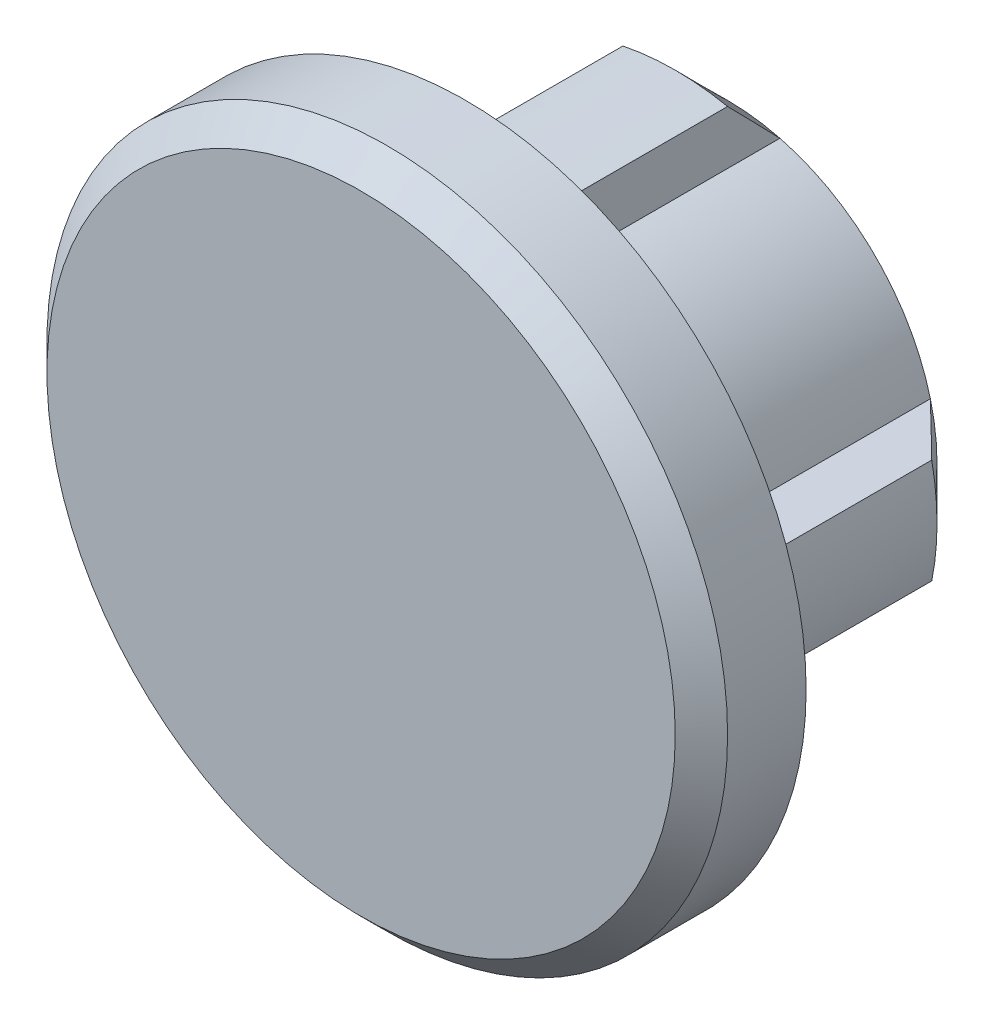
ISO-10303-21;
HEADER;
FILE_DESCRIPTION(('STEP AP214'),'2;1');
FILE_NAME('part.step','',(''),(''),'','','');
FILE_SCHEMA(('AUTOMOTIVE_DESIGN { 1 0 10303 214 1 1 1 1 }'));
ENDSEC;
DATA;
#1=APPLICATION_CONTEXT('core data for automotive mechanical design processes');
#2=APPLICATION_PROTOCOL_DEFINITION('international standard','automotive_design',2000,#1);
#3=PRODUCT_CONTEXT('',#1,'mechanical');
#4=PRODUCT('Part','Part','',(#3));
#5=PRODUCT_RELATED_PRODUCT_CATEGORY('part','',(#4));
#6=PRODUCT_DEFINITION_FORMATION('','',#4);
#7=PRODUCT_DEFINITION_CONTEXT('part definition',#1,'design');
#8=PRODUCT_DEFINITION('design','',#6,#7);
#9=PRODUCT_DEFINITION_SHAPE('','',#8);
#10=(LENGTH_UNIT() NAMED_UNIT(*) SI_UNIT(.MILLI.,.METRE.));
#11=(NAMED_UNIT(*) PLANE_ANGLE_UNIT() SI_UNIT($,.RADIAN.));
#12=(NAMED_UNIT(*) SI_UNIT($,.STERADIAN.) SOLID_ANGLE_UNIT());
#13=UNCERTAINTY_MEASURE_WITH_UNIT(LENGTH_MEASURE(1.E-05),#10,'distance_accuracy_value','');
#14=(GEOMETRIC_REPRESENTATION_CONTEXT(3) GLOBAL_UNCERTAINTY_ASSIGNED_CONTEXT((#13)) GLOBAL_UNIT_ASSIGNED_CONTEXT((#10,
#11,#12)) REPRESENTATION_CONTEXT('',''));
#15=CARTESIAN_POINT('',(0.,0.,0.));
#16=DIRECTION('',(0.,0.,1.));
#17=DIRECTION('',(1.,0.,0.));
#18=AXIS2_PLACEMENT_3D('',#15,#16,#17);
#19=CARTESIAN_POINT('',(0.,0.,-5.));
#20=DIRECTION('',(0.,0.,1.));
#21=DIRECTION('',(1.,0.,0.));
#22=AXIS2_PLACEMENT_3D('',#19,#20,#21);
#23=CYLINDRICAL_SURFACE('',#22,5.);
#24=DIRECTION('',(0.,0.,-1.));
#25=VECTOR('',#24,1.);
#26=CARTESIAN_POINT('',(-4.89897948556636,1.,5.51398966790242));
#27=LINE('',#26,#25);
#28=CARTESIAN_POINT('',(-4.89897948556636,1.,0.));
#29=VERTEX_POINT('',#28);
#30=CARTESIAN_POINT('',(-4.89897948556636,1.,-4.));
#31=VERTEX_POINT('',#30);
#32=EDGE_CURVE('E261',#29,#31,#27,.T.);
#33=ORIENTED_EDGE('',*,*,#32,.T.);
#34=CARTESIAN_POINT('',(0.,0.,-4.));
#35=DIRECTION('',(0.,0.,1.));
#36=DIRECTION('',(1.,0.,0.));
#37=AXIS2_PLACEMENT_3D('',#34,#35,#36);
#38=CIRCLE('',#37,5.);
#39=CARTESIAN_POINT('',(-4.89897948556636,-1.,-4.));
#40=VERTEX_POINT('',#39);
#41=EDGE_CURVE('E699',#31,#40,#38,.T.);
#42=ORIENTED_EDGE('',*,*,#41,.T.);
#43=DIRECTION('',(0.,0.,-1.));
#44=VECTOR('',#43,1.);
#45=CARTESIAN_POINT('',(-4.89897948556636,-1.,5.51398966790242));
#46=LINE('',#45,#44);
#47=CARTESIAN_POINT('',(-4.89897948556636,-1.,0.));
#48=VERTEX_POINT('',#47);
#49=EDGE_CURVE('E203',#48,#40,#46,.T.);
#50=ORIENTED_EDGE('',*,*,#49,.F.);
#51=CARTESIAN_POINT('',(0.,0.,0.));
#52=DIRECTION('',(0.,0.,1.));
#53=DIRECTION('',(1.,0.,0.));
#54=AXIS2_PLACEMENT_3D('',#51,#52,#53);
#55=CIRCLE('',#54,5.);
#56=CARTESIAN_POINT('',(-4.58257569495584,-2.,0.));
#57=VERTEX_POINT('',#56);
#58=EDGE_CURVE('E197',#57,#48,#55,.F.);
#59=ORIENTED_EDGE('',*,*,#58,.F.);
#60=DIRECTION('',(0.,0.,-1.));
#61=VECTOR('',#60,1.);
#62=CARTESIAN_POINT('',(-4.58257569495584,-2.,0.5));
#63=LINE('',#62,#61);
#64=CARTESIAN_POINT('',(-4.58257569495584,-2.,0.5));
#65=VERTEX_POINT('',#64);
#66=EDGE_CURVE('E294',#65,#57,#63,.T.);
#67=ORIENTED_EDGE('',*,*,#66,.F.);
#68=CARTESIAN_POINT('',(0.,0.,0.5));
#69=DIRECTION('',(0.,0.,1.));
#70=DIRECTION('',(-1.,0.,0.));
#71=AXIS2_PLACEMENT_3D('',#68,#69,#70);
#72=CIRCLE('',#71,5.);
#73=CARTESIAN_POINT('',(-4.58257569495584,2.,0.5));
#74=VERTEX_POINT('',#73);
#75=EDGE_CURVE('E282',#74,#65,#72,.T.);
#76=ORIENTED_EDGE('',*,*,#75,.F.);
#77=DIRECTION('',(0.,0.,-1.));
#78=VECTOR('',#77,1.);
#79=CARTESIAN_POINT('',(-4.58257569495584,2.,0.5));
#80=LINE('',#79,#78);
#81=CARTESIAN_POINT('',(-4.58257569495584,2.,0.));
#82=VERTEX_POINT('',#81);
#83=EDGE_CURVE('E298',#74,#82,#80,.T.);
#84=ORIENTED_EDGE('',*,*,#83,.T.);
#85=CARTESIAN_POINT('',(0.,0.,0.));
#86=DIRECTION('',(0.,0.,1.));
#87=DIRECTION('',(1.,0.,0.));
#88=AXIS2_PLACEMENT_3D('',#85,#86,#87);
#89=CIRCLE('',#88,5.);
#90=EDGE_CURVE('E271',#29,#82,#89,.F.);
#91=ORIENTED_EDGE('',*,*,#90,.F.);
#92=EDGE_LOOP('',(#33,#42,#50,#59,#67,#76,#84,#91));
#93=FACE_BOUND('',#92,.T.);
#94=ADVANCED_FACE('F33',(#93),#23,.T.);
#95=DIRECTION('',(0.,0.,-1.));
#96=VECTOR('',#95,1.);
#97=CARTESIAN_POINT('',(-1.,-4.89897948556636,5.51398966790242));
#98=LINE('',#97,#96);
#99=CARTESIAN_POINT('',(-1.,-4.89897948556636,0.));
#100=VERTEX_POINT('',#99);
#101=CARTESIAN_POINT('',(-1.,-4.89897948556636,-4.));
#102=VERTEX_POINT('',#101);
#103=EDGE_CURVE('E204',#100,#102,#98,.T.);
#104=ORIENTED_EDGE('',*,*,#103,.T.);
#105=CARTESIAN_POINT('',(0.,0.,-4.));
#106=DIRECTION('',(0.,0.,1.));
#107=DIRECTION('',(1.,0.,0.));
#108=AXIS2_PLACEMENT_3D('',#105,#106,#107);
#109=CIRCLE('',#108,5.);
#110=CARTESIAN_POINT('',(0.999999999999999,-4.89897948556636,-4.));
#111=VERTEX_POINT('',#110);
#112=EDGE_CURVE('E365',#102,#111,#109,.T.);
#113=ORIENTED_EDGE('',*,*,#112,.T.);
#114=DIRECTION('',(0.,0.,-1.));
#115=VECTOR('',#114,1.);
#116=CARTESIAN_POINT('',(0.999999999999999,-4.89897948556636,5.51398966790242));
#117=LINE('',#116,#115);
#118=CARTESIAN_POINT('',(0.999999999999999,-4.89897948556636,0.));
#119=VERTEX_POINT('',#118);
#120=EDGE_CURVE('E226',#119,#111,#117,.T.);
#121=ORIENTED_EDGE('',*,*,#120,.F.);
#122=CARTESIAN_POINT('',(0.,0.,0.));
#123=DIRECTION('',(0.,0.,1.));
#124=DIRECTION('',(1.,0.,0.));
#125=AXIS2_PLACEMENT_3D('',#122,#123,#124);
#126=CIRCLE('',#125,5.);
#127=EDGE_CURVE('E318',#100,#119,#126,.T.);
#128=ORIENTED_EDGE('',*,*,#127,.F.);
#129=EDGE_LOOP('',(#104,#113,#121,#128));
#130=FACE_BOUND('',#129,.T.);
#131=ADVANCED_FACE('F485',(#130),#23,.T.);
#132=DIRECTION('',(0.,0.,-1.));
#133=VECTOR('',#132,1.);
#134=CARTESIAN_POINT('',(1.,4.89897948556636,5.51398966790242));
#135=LINE('',#134,#133);
#136=CARTESIAN_POINT('',(1.,4.89897948556636,0.));
#137=VERTEX_POINT('',#136);
#138=CARTESIAN_POINT('',(1.,4.89897948556636,-4.));
#139=VERTEX_POINT('',#138);
#140=EDGE_CURVE('E237',#137,#139,#135,.T.);
#141=ORIENTED_EDGE('',*,*,#140,.T.);
#142=CARTESIAN_POINT('',(0.,0.,-4.));
#143=DIRECTION('',(0.,0.,1.));
#144=DIRECTION('',(1.,0.,0.));
#145=AXIS2_PLACEMENT_3D('',#142,#143,#144);
#146=CIRCLE('',#145,5.);
#147=CARTESIAN_POINT('',(-1.,4.89897948556636,-4.));
#148=VERTEX_POINT('',#147);
#149=EDGE_CURVE('E327',#139,#148,#146,.T.);
#150=ORIENTED_EDGE('',*,*,#149,.T.);
#151=DIRECTION('',(0.,0.,-1.));
#152=VECTOR('',#151,1.);
#153=CARTESIAN_POINT('',(-1.,4.89897948556636,5.51398966790242));
#154=LINE('',#153,#152);
#155=CARTESIAN_POINT('',(-1.,4.89897948556636,0.));
#156=VERTEX_POINT('',#155);
#157=EDGE_CURVE('E270',#156,#148,#154,.T.);
#158=ORIENTED_EDGE('',*,*,#157,.F.);
#159=EDGE_CURVE('E317',#137,#156,#126,.T.);
#160=ORIENTED_EDGE('',*,*,#159,.F.);
#161=EDGE_LOOP('',(#141,#150,#158,#160));
#162=FACE_BOUND('',#161,.T.);
#163=ADVANCED_FACE('F441',(#162),#23,.T.);
#164=DIRECTION('',(0.,0.,-1.));
#165=VECTOR('',#164,1.);
#166=CARTESIAN_POINT('',(4.89897948556636,-1.,5.51398966790242));
#167=LINE('',#166,#165);
#168=CARTESIAN_POINT('',(4.89897948556636,-1.,0.));
#169=VERTEX_POINT('',#168);
#170=CARTESIAN_POINT('',(4.89897948556636,-1.,-4.));
#171=VERTEX_POINT('',#170);
#172=EDGE_CURVE('E220',#169,#171,#167,.T.);
#173=ORIENTED_EDGE('',*,*,#172,.T.);
#174=CARTESIAN_POINT('',(0.,0.,-4.));
#175=DIRECTION('',(0.,0.,1.));
#176=DIRECTION('',(1.,0.,0.));
#177=AXIS2_PLACEMENT_3D('',#174,#175,#176);
#178=CIRCLE('',#177,5.);
#179=CARTESIAN_POINT('',(4.89897948556636,0.999999999999999,-4.));
#180=VERTEX_POINT('',#179);
#181=EDGE_CURVE('E394',#171,#180,#178,.T.);
#182=ORIENTED_EDGE('',*,*,#181,.T.);
#183=DIRECTION('',(0.,0.,-1.));
#184=VECTOR('',#183,1.);
#185=CARTESIAN_POINT('',(4.89897948556636,0.999999999999999,5.51398966790242));
#186=LINE('',#185,#184);
#187=CARTESIAN_POINT('',(4.89897948556636,0.999999999999999,0.));
#188=VERTEX_POINT('',#187);
#189=EDGE_CURVE('E246',#188,#180,#186,.T.);
#190=ORIENTED_EDGE('',*,*,#189,.F.);
#191=EDGE_CURVE('E321',#169,#188,#126,.T.);
#192=ORIENTED_EDGE('',*,*,#191,.F.);
#193=EDGE_LOOP('',(#173,#182,#190,#192));
#194=FACE_BOUND('',#193,.T.);
#195=ADVANCED_FACE('F431',(#194),#23,.T.);
#196=CARTESIAN_POINT('',(0.,0.,-5.));
#197=DIRECTION('',(0.,0.,1.));
#198=DIRECTION('',(1.,0.,0.));
#199=AXIS2_PLACEMENT_3D('',#196,#197,#198);
#200=PLANE('',#199);
#201=CARTESIAN_POINT('',(0.,0.,-5.));
#202=DIRECTION('',(0.,0.,1.));
#203=DIRECTION('',(-1.,0.,0.));
#204=AXIS2_PLACEMENT_3D('',#201,#202,#203);
#205=CIRCLE('',#204,4.);
#206=CARTESIAN_POINT('',(-1.,3.87298334620742,-5.));
#207=VERTEX_POINT('',#206);
#208=CARTESIAN_POINT('',(-3.87298334620742,1.,-5.));
#209=VERTEX_POINT('',#208);
#210=EDGE_CURVE('E255',#207,#209,#205,.T.);
#211=ORIENTED_EDGE('',*,*,#210,.F.);
#212=CARTESIAN_POINT('',(0.,0.,-5.));
#213=DIRECTION('',(0.,0.,1.));
#214=DIRECTION('',(1.,0.,0.));
#215=AXIS2_PLACEMENT_3D('',#212,#213,#214);
#216=CIRCLE('',#215,4.);
#217=CARTESIAN_POINT('',(1.,3.87298334620742,-5.));
#218=VERTEX_POINT('',#217);
#219=EDGE_CURVE('E447',#207,#218,#216,.F.);
#220=ORIENTED_EDGE('',*,*,#219,.T.);
#221=CARTESIAN_POINT('',(0.,0.,-5.));
#222=DIRECTION('',(0.,0.,1.));
#223=DIRECTION('',(-1.,0.,0.));
#224=AXIS2_PLACEMENT_3D('',#221,#222,#223);
#225=CIRCLE('',#224,4.);
#226=CARTESIAN_POINT('',(3.87298334620742,0.999999999999999,-5.));
#227=VERTEX_POINT('',#226);
#228=EDGE_CURVE('E232',#227,#218,#225,.T.);
#229=ORIENTED_EDGE('',*,*,#228,.F.);
#230=CARTESIAN_POINT('',(0.,0.,-5.));
#231=DIRECTION('',(0.,0.,1.));
#232=DIRECTION('',(1.,0.,0.));
#233=AXIS2_PLACEMENT_3D('',#230,#231,#232);
#234=CIRCLE('',#233,4.);
#235=CARTESIAN_POINT('',(3.87298334620742,-1.,-5.));
#236=VERTEX_POINT('',#235);
#237=EDGE_CURVE('E337',#227,#236,#234,.F.);
#238=ORIENTED_EDGE('',*,*,#237,.T.);
#239=CARTESIAN_POINT('',(0.,0.,-5.));
#240=DIRECTION('',(0.,0.,1.));
#241=DIRECTION('',(-1.,0.,0.));
#242=AXIS2_PLACEMENT_3D('',#239,#240,#241);
#243=CIRCLE('',#242,4.);
#244=CARTESIAN_POINT('',(0.999999999999999,-3.87298334620742,-5.));
#245=VERTEX_POINT('',#244);
#246=EDGE_CURVE('E211',#245,#236,#243,.T.);
#247=ORIENTED_EDGE('',*,*,#246,.F.);
#248=CARTESIAN_POINT('',(0.,0.,-5.));
#249=DIRECTION('',(0.,0.,1.));
#250=DIRECTION('',(1.,0.,0.));
#251=AXIS2_PLACEMENT_3D('',#248,#249,#250);
#252=CIRCLE('',#251,4.);
#253=CARTESIAN_POINT('',(-1.,-3.87298334620742,-5.));
#254=VERTEX_POINT('',#253);
#255=EDGE_CURVE('E458',#245,#254,#252,.F.);
#256=ORIENTED_EDGE('',*,*,#255,.T.);
#257=CARTESIAN_POINT('',(0.,0.,-5.));
#258=DIRECTION('',(0.,0.,1.));
#259=DIRECTION('',(-1.,0.,0.));
#260=AXIS2_PLACEMENT_3D('',#257,#258,#259);
#261=CIRCLE('',#260,4.);
#262=CARTESIAN_POINT('',(-3.87298334620742,-1.,-5.));
#263=VERTEX_POINT('',#262);
#264=EDGE_CURVE('E198',#263,#254,#261,.T.);
#265=ORIENTED_EDGE('',*,*,#264,.F.);
#266=CARTESIAN_POINT('',(0.,0.,-5.));
#267=DIRECTION('',(0.,0.,1.));
#268=DIRECTION('',(1.,0.,0.));
#269=AXIS2_PLACEMENT_3D('',#266,#267,#268);
#270=CIRCLE('',#269,4.);
#271=EDGE_CURVE('E457',#263,#209,#270,.F.);
#272=ORIENTED_EDGE('',*,*,#271,.T.);
#273=EDGE_LOOP('',(#211,#220,#229,#238,#247,#256,#265,#272));
#274=FACE_BOUND('',#273,.T.);
#275=CARTESIAN_POINT('',(0.,0.,-5.));
#276=DIRECTION('',(0.,0.,1.));
#277=DIRECTION('',(1.,0.,0.));
#278=AXIS2_PLACEMENT_3D('',#275,#276,#277);
#279=CIRCLE('',#278,2.5);
#280=CARTESIAN_POINT('',(2.5,0.,-5.));
#281=VERTEX_POINT('',#280);
#282=EDGE_CURVE('E314',#281,#281,#279,.T.);
#283=ORIENTED_EDGE('',*,*,#282,.T.);
#284=EDGE_LOOP('',(#283));
#285=FACE_BOUND('',#284,.T.);
#286=ADVANCED_FACE('F453',(#274,#285),#200,.F.);
#287=CARTESIAN_POINT('',(0.,0.,-5.));
#288=DIRECTION('',(0.,0.,1.));
#289=DIRECTION('',(1.,0.,0.));
#290=AXIS2_PLACEMENT_3D('',#287,#288,#289);
#291=CYLINDRICAL_SURFACE('',#290,2.5);
#292=ORIENTED_EDGE('',*,*,#282,.F.);
#293=EDGE_LOOP('',(#292));
#294=FACE_BOUND('',#293,.T.);
#295=CARTESIAN_POINT('',(0.,0.,0.));
#296=DIRECTION('',(0.,0.,1.));
#297=DIRECTION('',(1.,0.,0.));
#298=AXIS2_PLACEMENT_3D('',#295,#296,#297);
#299=CIRCLE('',#298,2.5);
#300=CARTESIAN_POINT('',(2.5,0.,0.));
#301=VERTEX_POINT('',#300);
#302=EDGE_CURVE('E311',#301,#301,#299,.F.);
#303=ORIENTED_EDGE('',*,*,#302,.F.);
#304=EDGE_LOOP('',(#303));
#305=FACE_BOUND('',#304,.T.);
#306=ADVANCED_FACE('F499',(#294,#305),#291,.F.);
#307=CARTESIAN_POINT('',(0.,0.,0.));
#308=DIRECTION('',(0.,0.,1.));
#309=DIRECTION('',(1.,0.,0.));
#310=AXIS2_PLACEMENT_3D('',#307,#308,#309);
#311=PLANE('',#310);
#312=ORIENTED_EDGE('',*,*,#302,.T.);
#313=EDGE_LOOP('',(#312));
#314=FACE_BOUND('',#313,.T.);
#315=ADVANCED_FACE('F538',(#314),#311,.F.);
#316=CARTESIAN_POINT('',(0.,0.,2.));
#317=DIRECTION('',(0.,0.,-1.));
#318=DIRECTION('',(-1.,0.,0.));
#319=AXIS2_PLACEMENT_3D('',#316,#317,#318);
#320=CYLINDRICAL_SURFACE('',#319,6.5);
#321=CARTESIAN_POINT('',(0.,0.,0.));
#322=DIRECTION('',(0.,0.,1.));
#323=DIRECTION('',(1.,0.,0.));
#324=AXIS2_PLACEMENT_3D('',#321,#322,#323);
#325=CIRCLE('',#324,6.5);
#326=CARTESIAN_POINT('',(-6.18465843842649,-2.,0.));
#327=VERTEX_POINT('',#326);
#328=CARTESIAN_POINT('',(-6.18465843842649,2.,0.));
#329=VERTEX_POINT('',#328);
#330=EDGE_CURVE('E301',#327,#329,#325,.T.);
#331=ORIENTED_EDGE('',*,*,#330,.T.);
#332=DIRECTION('',(0.,0.,-1.));
#333=VECTOR('',#332,1.);
#334=CARTESIAN_POINT('',(-6.18465843842649,2.,0.5));
#335=LINE('',#334,#333);
#336=CARTESIAN_POINT('',(-6.18465843842649,2.,0.5));
#337=VERTEX_POINT('',#336);
#338=EDGE_CURVE('E302',#337,#329,#335,.T.);
#339=ORIENTED_EDGE('',*,*,#338,.F.);
#340=CARTESIAN_POINT('',(0.,0.,0.5));
#341=DIRECTION('',(0.,0.,-1.));
#342=DIRECTION('',(-1.,0.,0.));
#343=AXIS2_PLACEMENT_3D('',#340,#341,#342);
#344=CIRCLE('',#343,6.5);
#345=CARTESIAN_POINT('',(-6.18465843842649,-2.,0.5));
#346=VERTEX_POINT('',#345);
#347=EDGE_CURVE('E289',#346,#337,#344,.T.);
#348=ORIENTED_EDGE('',*,*,#347,.F.);
#349=DIRECTION('',(0.,0.,-1.));
#350=VECTOR('',#349,1.);
#351=CARTESIAN_POINT('',(-6.18465843842649,-2.,0.5));
#352=LINE('',#351,#350);
#353=EDGE_CURVE('E304',#346,#327,#352,.T.);
#354=ORIENTED_EDGE('',*,*,#353,.T.);
#355=EDGE_LOOP('',(#331,#339,#348,#354));
#356=FACE_BOUND('',#355,.T.);
#357=CARTESIAN_POINT('',(0.,0.,1.5));
#358=DIRECTION('',(0.,0.,1.));
#359=DIRECTION('',(1.,0.,0.));
#360=AXIS2_PLACEMENT_3D('',#357,#358,#359);
#361=CIRCLE('',#360,6.5);
#362=CARTESIAN_POINT('',(6.5,0.,1.5));
#363=VERTEX_POINT('',#362);
#364=EDGE_CURVE('E324',#363,#363,#361,.F.);
#365=ORIENTED_EDGE('',*,*,#364,.T.);
#366=EDGE_LOOP('',(#365));
#367=FACE_BOUND('',#366,.T.);
#368=ADVANCED_FACE('F472',(#356,#367),#320,.T.);
#369=CARTESIAN_POINT('',(0.,0.,2.));
#370=DIRECTION('',(0.,0.,1.));
#371=DIRECTION('',(1.,0.,0.));
#372=AXIS2_PLACEMENT_3D('',#369,#370,#371);
#373=PLANE('',#372);
#374=CARTESIAN_POINT('',(0.,0.,2.));
#375=DIRECTION('',(0.,0.,1.));
#376=DIRECTION('',(1.,0.,0.));
#377=AXIS2_PLACEMENT_3D('',#374,#375,#376);
#378=CIRCLE('',#377,6.);
#379=CARTESIAN_POINT('',(6.,0.,2.));
#380=VERTEX_POINT('',#379);
#381=EDGE_CURVE('E320',#380,#380,#378,.T.);
#382=ORIENTED_EDGE('',*,*,#381,.T.);
#383=EDGE_LOOP('',(#382));
#384=FACE_BOUND('',#383,.T.);
#385=ADVANCED_FACE('F536',(#384),#373,.T.);
#386=DIRECTION('',(-1.,0.,0.));
#387=VECTOR('',#386,1.);
#388=CARTESIAN_POINT('',(-4.58257569495584,-2.,0.));
#389=LINE('',#388,#387);
#390=EDGE_CURVE('E281',#57,#327,#389,.T.);
#391=ORIENTED_EDGE('',*,*,#390,.F.);
#392=ORIENTED_EDGE('',*,*,#58,.T.);
#393=DIRECTION('',(1.,0.,0.));
#394=VECTOR('',#393,1.);
#395=CARTESIAN_POINT('',(-4.89897948556636,-1.,0.));
#396=LINE('',#395,#394);
#397=CARTESIAN_POINT('',(-3.87298334620742,-1.,0.));
#398=VERTEX_POINT('',#397);
#399=EDGE_CURVE('E191',#48,#398,#396,.T.);
#400=ORIENTED_EDGE('',*,*,#399,.T.);
#401=CARTESIAN_POINT('',(0.,0.,0.));
#402=DIRECTION('',(0.,0.,1.));
#403=DIRECTION('',(1.,0.,0.));
#404=AXIS2_PLACEMENT_3D('',#401,#402,#403);
#405=CIRCLE('',#404,4.);
#406=CARTESIAN_POINT('',(-1.,-3.87298334620742,0.));
#407=VERTEX_POINT('',#406);
#408=EDGE_CURVE('E176',#398,#407,#405,.T.);
#409=ORIENTED_EDGE('',*,*,#408,.T.);
#410=DIRECTION('',(0.,-1.,0.));
#411=VECTOR('',#410,1.);
#412=CARTESIAN_POINT('',(-1.,-3.87298334620742,0.));
#413=LINE('',#412,#411);
#414=EDGE_CURVE('E205',#407,#100,#413,.T.);
#415=ORIENTED_EDGE('',*,*,#414,.T.);
#416=ORIENTED_EDGE('',*,*,#127,.T.);
#417=DIRECTION('',(0.,1.,0.));
#418=VECTOR('',#417,1.);
#419=CARTESIAN_POINT('',(0.999999999999999,-3.87298334620742,0.));
#420=LINE('',#419,#418);
#421=CARTESIAN_POINT('',(0.999999999999999,-3.87298334620742,0.));
#422=VERTEX_POINT('',#421);
#423=EDGE_CURVE('E214',#119,#422,#420,.T.);
#424=ORIENTED_EDGE('',*,*,#423,.T.);
#425=CARTESIAN_POINT('',(0.,0.,0.));
#426=DIRECTION('',(0.,0.,1.));
#427=DIRECTION('',(1.,0.,0.));
#428=AXIS2_PLACEMENT_3D('',#425,#426,#427);
#429=CIRCLE('',#428,4.);
#430=CARTESIAN_POINT('',(3.87298334620742,-1.,0.));
#431=VERTEX_POINT('',#430);
#432=EDGE_CURVE('E222',#422,#431,#429,.T.);
#433=ORIENTED_EDGE('',*,*,#432,.T.);
#434=DIRECTION('',(1.,0.,0.));
#435=VECTOR('',#434,1.);
#436=CARTESIAN_POINT('',(3.87298334620742,-1.,0.));
#437=LINE('',#436,#435);
#438=EDGE_CURVE('E218',#431,#169,#437,.T.);
#439=ORIENTED_EDGE('',*,*,#438,.T.);
#440=ORIENTED_EDGE('',*,*,#191,.T.);
#441=DIRECTION('',(-1.,0.,0.));
#442=VECTOR('',#441,1.);
#443=CARTESIAN_POINT('',(3.87298334620742,0.999999999999999,0.));
#444=LINE('',#443,#442);
#445=CARTESIAN_POINT('',(3.87298334620742,0.999999999999999,0.));
#446=VERTEX_POINT('',#445);
#447=EDGE_CURVE('E243',#188,#446,#444,.T.);
#448=ORIENTED_EDGE('',*,*,#447,.T.);
#449=CARTESIAN_POINT('',(0.,0.,0.));
#450=DIRECTION('',(0.,0.,1.));
#451=DIRECTION('',(1.,0.,0.));
#452=AXIS2_PLACEMENT_3D('',#449,#450,#451);
#453=CIRCLE('',#452,4.);
#454=CARTESIAN_POINT('',(1.,3.87298334620742,0.));
#455=VERTEX_POINT('',#454);
#456=EDGE_CURVE('E238',#446,#455,#453,.T.);
#457=ORIENTED_EDGE('',*,*,#456,.T.);
#458=DIRECTION('',(0.,1.,0.));
#459=VECTOR('',#458,1.);
#460=CARTESIAN_POINT('',(1.,4.89897948556636,0.));
#461=LINE('',#460,#459);
#462=EDGE_CURVE('E235',#455,#137,#461,.T.);
#463=ORIENTED_EDGE('',*,*,#462,.T.);
#464=ORIENTED_EDGE('',*,*,#159,.T.);
#465=DIRECTION('',(0.,-1.,0.));
#466=VECTOR('',#465,1.);
#467=CARTESIAN_POINT('',(-1.,4.89897948556636,0.));
#468=LINE('',#467,#466);
#469=CARTESIAN_POINT('',(-1.,3.87298334620742,0.));
#470=VERTEX_POINT('',#469);
#471=EDGE_CURVE('E267',#156,#470,#468,.T.);
#472=ORIENTED_EDGE('',*,*,#471,.T.);
#473=CARTESIAN_POINT('',(0.,0.,0.));
#474=DIRECTION('',(0.,0.,1.));
#475=DIRECTION('',(1.,0.,0.));
#476=AXIS2_PLACEMENT_3D('',#473,#474,#475);
#477=CIRCLE('',#476,4.);
#478=CARTESIAN_POINT('',(-3.87298334620742,1.,0.));
#479=VERTEX_POINT('',#478);
#480=EDGE_CURVE('E262',#470,#479,#477,.T.);
#481=ORIENTED_EDGE('',*,*,#480,.T.);
#482=DIRECTION('',(-1.,0.,0.));
#483=VECTOR('',#482,1.);
#484=CARTESIAN_POINT('',(-4.89897948556636,1.,0.));
#485=LINE('',#484,#483);
#486=EDGE_CURVE('E258',#479,#29,#485,.T.);
#487=ORIENTED_EDGE('',*,*,#486,.T.);
#488=ORIENTED_EDGE('',*,*,#90,.T.);
#489=DIRECTION('',(1.,0.,0.));
#490=VECTOR('',#489,1.);
#491=CARTESIAN_POINT('',(-4.58257569495584,2.,0.));
#492=LINE('',#491,#490);
#493=EDGE_CURVE('E286',#329,#82,#492,.T.);
#494=ORIENTED_EDGE('',*,*,#493,.F.);
#495=ORIENTED_EDGE('',*,*,#330,.F.);
#496=EDGE_LOOP('',(#391,#392,#400,#409,#415,#416,#424,#433,#439,#440,#448,#457,#463,#464,#472,
#481,#487,#488,#494,#495));
#497=FACE_BOUND('',#496,.T.);
#498=ADVANCED_FACE('F196',(#497),#311,.F.);
#499=CARTESIAN_POINT('',(0.,0.,2.));
#500=DIRECTION('',(0.,0.,-1.));
#501=DIRECTION('',(-1.,0.,0.));
#502=AXIS2_PLACEMENT_3D('',#499,#500,#501);
#503=CONICAL_SURFACE('',#502,6.,0.785398163397445);
#504=ORIENTED_EDGE('',*,*,#364,.F.);
#505=EDGE_LOOP('',(#504));
#506=FACE_BOUND('',#505,.T.);
#507=ORIENTED_EDGE('',*,*,#381,.F.);
#508=EDGE_LOOP('',(#507));
#509=FACE_BOUND('',#508,.T.);
#510=ADVANCED_FACE('F529',(#506,#509),#503,.T.);
#511=CARTESIAN_POINT('',(-4.58257569495584,2.,0.5));
#512=DIRECTION('',(0.,1.,0.));
#513=DIRECTION('',(0.,0.,1.));
#514=AXIS2_PLACEMENT_3D('',#511,#512,#513);
#515=PLANE('',#514);
#516=ORIENTED_EDGE('',*,*,#493,.T.);
#517=ORIENTED_EDGE('',*,*,#83,.F.);
#518=DIRECTION('',(1.,0.,0.));
#519=VECTOR('',#518,1.);
#520=CARTESIAN_POINT('',(-4.58257569495584,2.,0.5));
#521=LINE('',#520,#519);
#522=EDGE_CURVE('E291',#337,#74,#521,.T.);
#523=ORIENTED_EDGE('',*,*,#522,.F.);
#524=ORIENTED_EDGE('',*,*,#338,.T.);
#525=EDGE_LOOP('',(#516,#517,#523,#524));
#526=FACE_BOUND('',#525,.T.);
#527=ADVANCED_FACE('F468',(#526),#515,.F.);
#528=CARTESIAN_POINT('',(-4.58257569495584,-2.,0.5));
#529=DIRECTION('',(0.,-1.,0.));
#530=DIRECTION('',(1.,0.,0.));
#531=AXIS2_PLACEMENT_3D('',#528,#529,#530);
#532=PLANE('',#531);
#533=ORIENTED_EDGE('',*,*,#390,.T.);
#534=ORIENTED_EDGE('',*,*,#353,.F.);
#535=DIRECTION('',(-1.,0.,0.));
#536=VECTOR('',#535,1.);
#537=CARTESIAN_POINT('',(-4.58257569495584,-2.,0.5));
#538=LINE('',#537,#536);
#539=EDGE_CURVE('E285',#65,#346,#538,.T.);
#540=ORIENTED_EDGE('',*,*,#539,.F.);
#541=ORIENTED_EDGE('',*,*,#66,.T.);
#542=EDGE_LOOP('',(#533,#534,#540,#541));
#543=FACE_BOUND('',#542,.T.);
#544=ADVANCED_FACE('F477',(#543),#532,.F.);
#545=CARTESIAN_POINT('',(0.,0.,0.5));
#546=DIRECTION('',(0.,0.,-1.));
#547=DIRECTION('',(-1.,0.,0.));
#548=AXIS2_PLACEMENT_3D('',#545,#546,#547);
#549=PLANE('',#548);
#550=ORIENTED_EDGE('',*,*,#75,.T.);
#551=ORIENTED_EDGE('',*,*,#539,.T.);
#552=ORIENTED_EDGE('',*,*,#347,.T.);
#553=ORIENTED_EDGE('',*,*,#522,.T.);
#554=EDGE_LOOP('',(#550,#551,#552,#553));
#555=FACE_BOUND('',#554,.T.);
#556=ADVANCED_FACE('F355',(#555),#549,.T.);
#557=CARTESIAN_POINT('',(-4.89897948556636,1.,5.51398966790242));
#558=DIRECTION('',(0.,-1.,0.));
#559=DIRECTION('',(1.,0.,0.));
#560=AXIS2_PLACEMENT_3D('',#557,#558,#559);
#561=PLANE('',#560);
#562=DIRECTION('',(0.,0.,-1.));
#563=VECTOR('',#562,1.);
#564=CARTESIAN_POINT('',(-3.87298334620742,1.,5.51398966790242));
#565=LINE('',#564,#563);
#566=EDGE_CURVE('E265',#479,#209,#565,.T.);
#567=ORIENTED_EDGE('',*,*,#566,.T.);
#568=CARTESIAN_POINT('',(-3.87298334620741,1.,-5.));
#569=CARTESIAN_POINT('',(-3.95875684043803,1.,-4.91694797825705));
#570=CARTESIAN_POINT('',(-4.04444634845927,1.,-4.83380931579101));
#571=CARTESIAN_POINT('',(-4.21568142643342,1.,-4.66738424698905));
#572=CARTESIAN_POINT('',(-4.30122699669579,1.,-4.58409784097157));
#573=CARTESIAN_POINT('',(-4.47219854636474,1.,-4.41740251966488));
#574=CARTESIAN_POINT('',(-4.55762452584995,1.,-4.33399360445629));
#575=CARTESIAN_POINT('',(-4.72837434942724,1.,-4.16707092300234));
#576=CARTESIAN_POINT('',(-4.81369819329967,1.,-4.08355715653226));
#577=CARTESIAN_POINT('',(-4.89897948556636,1.,-4.));
#578=B_SPLINE_CURVE_WITH_KNOTS('',3,(#568,#569,#570,#571,#572,#573,#574,#575,#576,#577),
.UNSPECIFIED.,.F.,.F.,(4,2,2,2,4),(0.,0.358179371540301,0.716357972011553,1.07453633689908,
1.43271547073173),.UNSPECIFIED.);
#579=EDGE_CURVE('E359',#209,#31,#578,.T.);
#580=ORIENTED_EDGE('',*,*,#579,.T.);
#581=ORIENTED_EDGE('',*,*,#32,.F.);
#582=ORIENTED_EDGE('',*,*,#486,.F.);
#583=EDGE_LOOP('',(#567,#580,#581,#582));
#584=FACE_BOUND('',#583,.T.);
#585=ADVANCED_FACE('F349',(#584),#561,.F.);
#586=CARTESIAN_POINT('',(-1.,4.89897948556636,5.51398966790242));
#587=DIRECTION('',(1.,0.,0.));
#588=DIRECTION('',(0.,1.,0.));
#589=AXIS2_PLACEMENT_3D('',#586,#587,#588);
#590=PLANE('',#589);
#591=ORIENTED_EDGE('',*,*,#157,.T.);
#592=CARTESIAN_POINT('',(-1.,4.89897948556636,-4.));
#593=CARTESIAN_POINT('',(-1.,4.81369819329967,-4.08355715653226));
#594=CARTESIAN_POINT('',(-1.,4.72837434942724,-4.16707092300234));
#595=CARTESIAN_POINT('',(-1.,4.55762452584995,-4.33399360445629));
#596=CARTESIAN_POINT('',(-1.,4.47219854636474,-4.41740251966488));
#597=CARTESIAN_POINT('',(-1.,4.30122699669579,-4.58409784097157));
#598=CARTESIAN_POINT('',(-1.,4.21568142643342,-4.66738424698905));
#599=CARTESIAN_POINT('',(-1.,4.04444634845927,-4.83380931579101));
#600=CARTESIAN_POINT('',(-1.,3.95875684043803,-4.91694797825705));
#601=CARTESIAN_POINT('',(-1.,3.87298334620741,-5.));
#602=B_SPLINE_CURVE_WITH_KNOTS('',3,(#592,#593,#594,#595,#596,#597,#598,#599,#600,#601),
.UNSPECIFIED.,.F.,.F.,(4,2,2,2,4),(0.,0.358179133832655,0.716357498720178,1.07453609919143,
1.43271547073173),.UNSPECIFIED.);
#603=EDGE_CURVE('E330',#148,#207,#602,.T.);
#604=ORIENTED_EDGE('',*,*,#603,.T.);
#605=DIRECTION('',(0.,0.,-1.));
#606=VECTOR('',#605,1.);
#607=CARTESIAN_POINT('',(-1.,3.87298334620742,5.51398966790242));
#608=LINE('',#607,#606);
#609=EDGE_CURVE('E266',#470,#207,#608,.T.);
#610=ORIENTED_EDGE('',*,*,#609,.F.);
#611=ORIENTED_EDGE('',*,*,#471,.F.);
#612=EDGE_LOOP('',(#591,#604,#610,#611));
#613=FACE_BOUND('',#612,.T.);
#614=ADVANCED_FACE('F343',(#613),#590,.F.);
#615=CARTESIAN_POINT('',(0.,0.,5.51398966790242));
#616=DIRECTION('',(0.,0.,-1.));
#617=DIRECTION('',(-1.,0.,0.));
#618=AXIS2_PLACEMENT_3D('',#615,#616,#617);
#619=CYLINDRICAL_SURFACE('',#618,4.);
#620=ORIENTED_EDGE('',*,*,#609,.T.);
#621=ORIENTED_EDGE('',*,*,#210,.T.);
#622=ORIENTED_EDGE('',*,*,#566,.F.);
#623=ORIENTED_EDGE('',*,*,#480,.F.);
#624=EDGE_LOOP('',(#620,#621,#622,#623));
#625=FACE_BOUND('',#624,.T.);
#626=ADVANCED_FACE('F348',(#625),#619,.T.);
#627=CARTESIAN_POINT('',(1.,4.89897948556636,5.51398966790242));
#628=DIRECTION('',(-1.,0.,0.));
#629=DIRECTION('',(0.,-1.,0.));
#630=AXIS2_PLACEMENT_3D('',#627,#628,#629);
#631=PLANE('',#630);
#632=DIRECTION('',(0.,0.,-1.));
#633=VECTOR('',#632,1.);
#634=CARTESIAN_POINT('',(1.,3.87298334620742,5.51398966790242));
#635=LINE('',#634,#633);
#636=EDGE_CURVE('E241',#455,#218,#635,.T.);
#637=ORIENTED_EDGE('',*,*,#636,.T.);
#638=CARTESIAN_POINT('',(1.,3.87298334620741,-5.));
#639=CARTESIAN_POINT('',(1.,3.95875684043803,-4.91694797825705));
#640=CARTESIAN_POINT('',(1.,4.04444634845927,-4.83380931579101));
#641=CARTESIAN_POINT('',(1.,4.21568142643342,-4.66738424698905));
#642=CARTESIAN_POINT('',(1.,4.30122699669579,-4.58409784097157));
#643=CARTESIAN_POINT('',(1.,4.47219854636474,-4.41740251966488));
#644=CARTESIAN_POINT('',(1.,4.55762452584995,-4.33399360445629));
#645=CARTESIAN_POINT('',(1.,4.72837434942724,-4.16707092300234));
#646=CARTESIAN_POINT('',(1.,4.81369819329967,-4.08355715653226));
#647=CARTESIAN_POINT('',(1.,4.89897948556636,-4.));
#648=B_SPLINE_CURVE_WITH_KNOTS('',3,(#638,#639,#640,#641,#642,#643,#644,#645,#646,#647),
.UNSPECIFIED.,.F.,.F.,(4,2,2,2,4),(0.,0.358179371540301,0.716357972011553,1.07453633689908,
1.43271547073173),.UNSPECIFIED.);
#649=EDGE_CURVE('E446',#218,#139,#648,.T.);
#650=ORIENTED_EDGE('',*,*,#649,.T.);
#651=ORIENTED_EDGE('',*,*,#140,.F.);
#652=ORIENTED_EDGE('',*,*,#462,.F.);
#653=EDGE_LOOP('',(#637,#650,#651,#652));
#654=FACE_BOUND('',#653,.T.);
#655=ADVANCED_FACE('F422',(#654),#631,.F.);
#656=CARTESIAN_POINT('',(3.87298334620742,0.999999999999999,5.51398966790242));
#657=DIRECTION('',(0.,-1.,0.));
#658=DIRECTION('',(1.,0.,0.));
#659=AXIS2_PLACEMENT_3D('',#656,#657,#658);
#660=PLANE('',#659);
#661=ORIENTED_EDGE('',*,*,#189,.T.);
#662=CARTESIAN_POINT('',(4.89897948556636,0.999999999999999,-4.));
#663=CARTESIAN_POINT('',(4.81369819329967,0.999999999999999,-4.08355715653226));
#664=CARTESIAN_POINT('',(4.72837434942724,0.999999999999999,-4.16707092300234));
#665=CARTESIAN_POINT('',(4.55762452584995,0.999999999999999,-4.33399360445629));
#666=CARTESIAN_POINT('',(4.47219854636475,0.999999999999999,-4.41740251966488));
#667=CARTESIAN_POINT('',(4.30122699669579,0.999999999999999,-4.58409784097157));
#668=CARTESIAN_POINT('',(4.21568142643342,0.999999999999999,-4.66738424698905));
#669=CARTESIAN_POINT('',(4.04444634845927,0.999999999999999,-4.83380931579101));
#670=CARTESIAN_POINT('',(3.95875684043803,0.999999999999999,-4.91694797825705));
#671=CARTESIAN_POINT('',(3.87298334620741,0.999999999999999,-5.));
#672=B_SPLINE_CURVE_WITH_KNOTS('',3,(#662,#663,#664,#665,#666,#667,#668,#669,#670,#671),
.UNSPECIFIED.,.F.,.F.,(4,2,2,2,4),(0.,0.358179133832654,0.716357498720178,1.07453609919143,
1.43271547073173),.UNSPECIFIED.);
#673=EDGE_CURVE('E46',#180,#227,#672,.T.);
#674=ORIENTED_EDGE('',*,*,#673,.T.);
#675=DIRECTION('',(0.,0.,-1.));
#676=VECTOR('',#675,1.);
#677=CARTESIAN_POINT('',(3.87298334620742,0.999999999999999,5.51398966790242));
#678=LINE('',#677,#676);
#679=EDGE_CURVE('E242',#446,#227,#678,.T.);
#680=ORIENTED_EDGE('',*,*,#679,.F.);
#681=ORIENTED_EDGE('',*,*,#447,.F.);
#682=EDGE_LOOP('',(#661,#674,#680,#681));
#683=FACE_BOUND('',#682,.T.);
#684=ADVANCED_FACE('F418',(#683),#660,.F.);
#685=CARTESIAN_POINT('',(0.,0.,5.51398966790242));
#686=DIRECTION('',(0.,0.,-1.));
#687=DIRECTION('',(-1.,0.,0.));
#688=AXIS2_PLACEMENT_3D('',#685,#686,#687);
#689=CYLINDRICAL_SURFACE('',#688,4.);
#690=ORIENTED_EDGE('',*,*,#679,.T.);
#691=ORIENTED_EDGE('',*,*,#228,.T.);
#692=ORIENTED_EDGE('',*,*,#636,.F.);
#693=ORIENTED_EDGE('',*,*,#456,.F.);
#694=EDGE_LOOP('',(#690,#691,#692,#693));
#695=FACE_BOUND('',#694,.T.);
#696=ADVANCED_FACE('F414',(#695),#689,.T.);
#697=CARTESIAN_POINT('',(0.999999999999999,-3.87298334620742,5.51398966790242));
#698=DIRECTION('',(-1.,0.,0.));
#699=DIRECTION('',(0.,-1.,0.));
#700=AXIS2_PLACEMENT_3D('',#697,#698,#699);
#701=PLANE('',#700);
#702=ORIENTED_EDGE('',*,*,#120,.T.);
#703=CARTESIAN_POINT('',(0.999999999999999,-4.89897948556636,-4.));
#704=CARTESIAN_POINT('',(0.999999999999999,-4.81369819329967,-4.08355715653226));
#705=CARTESIAN_POINT('',(0.999999999999999,-4.72837434942724,-4.16707092300234));
#706=CARTESIAN_POINT('',(0.999999999999999,-4.55762452584995,-4.33399360445629));
#707=CARTESIAN_POINT('',(0.999999999999999,-4.47219854636475,-4.41740251966488));
#708=CARTESIAN_POINT('',(0.999999999999999,-4.30122699669579,-4.58409784097157));
#709=CARTESIAN_POINT('',(0.999999999999999,-4.21568142643342,-4.66738424698905));
#710=CARTESIAN_POINT('',(0.999999999999999,-4.04444634845927,-4.83380931579101));
#711=CARTESIAN_POINT('',(0.999999999999999,-3.95875684043803,-4.91694797825705));
#712=CARTESIAN_POINT('',(0.999999999999999,-3.87298334620741,-5.));
#713=B_SPLINE_CURVE_WITH_KNOTS('',3,(#703,#704,#705,#706,#707,#708,#709,#710,#711,#712),
.UNSPECIFIED.,.F.,.F.,(4,2,2,2,4),(0.,0.358179133832654,0.716357498720178,1.07453609919143,
1.43271547073173),.UNSPECIFIED.);
#714=EDGE_CURVE('E382',#111,#245,#713,.T.);
#715=ORIENTED_EDGE('',*,*,#714,.T.);
#716=DIRECTION('',(0.,0.,-1.));
#717=VECTOR('',#716,1.);
#718=CARTESIAN_POINT('',(0.999999999999999,-3.87298334620742,5.51398966790242));
#719=LINE('',#718,#717);
#720=EDGE_CURVE('E217',#422,#245,#719,.T.);
#721=ORIENTED_EDGE('',*,*,#720,.F.);
#722=ORIENTED_EDGE('',*,*,#423,.F.);
#723=EDGE_LOOP('',(#702,#715,#721,#722));
#724=FACE_BOUND('',#723,.T.);
#725=ADVANCED_FACE('F409',(#724),#701,.F.);
#726=CARTESIAN_POINT('',(0.,0.,5.51398966790242));
#727=DIRECTION('',(0.,0.,-1.));
#728=DIRECTION('',(-1.,0.,0.));
#729=AXIS2_PLACEMENT_3D('',#726,#727,#728);
#730=CYLINDRICAL_SURFACE('',#729,4.);
#731=ORIENTED_EDGE('',*,*,#720,.T.);
#732=ORIENTED_EDGE('',*,*,#246,.T.);
#733=DIRECTION('',(0.,0.,-1.));
#734=VECTOR('',#733,1.);
#735=CARTESIAN_POINT('',(3.87298334620742,-1.,5.51398966790242));
#736=LINE('',#735,#734);
#737=EDGE_CURVE('E221',#431,#236,#736,.T.);
#738=ORIENTED_EDGE('',*,*,#737,.F.);
#739=ORIENTED_EDGE('',*,*,#432,.F.);
#740=EDGE_LOOP('',(#731,#732,#738,#739));
#741=FACE_BOUND('',#740,.T.);
#742=ADVANCED_FACE('F407',(#741),#730,.T.);
#743=CARTESIAN_POINT('',(3.87298334620742,-1.,5.51398966790242));
#744=DIRECTION('',(0.,1.,0.));
#745=DIRECTION('',(-1.,0.,0.));
#746=AXIS2_PLACEMENT_3D('',#743,#744,#745);
#747=PLANE('',#746);
#748=ORIENTED_EDGE('',*,*,#737,.T.);
#749=CARTESIAN_POINT('',(3.87298334620741,-1.,-5.));
#750=CARTESIAN_POINT('',(3.95875684043803,-1.,-4.91694797825705));
#751=CARTESIAN_POINT('',(4.04444634845927,-1.,-4.83380931579101));
#752=CARTESIAN_POINT('',(4.21568142643342,-1.,-4.66738424698905));
#753=CARTESIAN_POINT('',(4.30122699669579,-1.,-4.58409784097157));
#754=CARTESIAN_POINT('',(4.47219854636474,-1.,-4.41740251966488));
#755=CARTESIAN_POINT('',(4.55762452584995,-1.,-4.33399360445629));
#756=CARTESIAN_POINT('',(4.72837434942724,-1.,-4.16707092300234));
#757=CARTESIAN_POINT('',(4.81369819329967,-1.,-4.08355715653226));
#758=CARTESIAN_POINT('',(4.89897948556636,-1.,-4.));
#759=B_SPLINE_CURVE_WITH_KNOTS('',3,(#749,#750,#751,#752,#753,#754,#755,#756,#757,#758),
.UNSPECIFIED.,.F.,.F.,(4,2,2,2,4),(0.,0.358179371540302,0.716357972011553,1.07453633689908,
1.43271547073173),.UNSPECIFIED.);
#760=EDGE_CURVE('E11',#236,#171,#759,.T.);
#761=ORIENTED_EDGE('',*,*,#760,.T.);
#762=ORIENTED_EDGE('',*,*,#172,.F.);
#763=ORIENTED_EDGE('',*,*,#438,.F.);
#764=EDGE_LOOP('',(#748,#761,#762,#763));
#765=FACE_BOUND('',#764,.T.);
#766=ADVANCED_FACE('F403',(#765),#747,.F.);
#767=CARTESIAN_POINT('',(-4.89897948556636,-1.,5.51398966790242));
#768=DIRECTION('',(0.,1.,0.));
#769=DIRECTION('',(-1.,0.,0.));
#770=AXIS2_PLACEMENT_3D('',#767,#768,#769);
#771=PLANE('',#770);
#772=ORIENTED_EDGE('',*,*,#49,.T.);
#773=CARTESIAN_POINT('',(-4.89897948556636,-1.,-4.));
#774=CARTESIAN_POINT('',(-4.81369819329967,-1.,-4.08355715653226));
#775=CARTESIAN_POINT('',(-4.72837434942724,-1.,-4.16707092300234));
#776=CARTESIAN_POINT('',(-4.55762452584995,-1.,-4.33399360445629));
#777=CARTESIAN_POINT('',(-4.47219854636474,-1.,-4.41740251966488));
#778=CARTESIAN_POINT('',(-4.30122699669579,-1.,-4.58409784097157));
#779=CARTESIAN_POINT('',(-4.21568142643342,-1.,-4.66738424698905));
#780=CARTESIAN_POINT('',(-4.04444634845927,-1.,-4.83380931579101));
#781=CARTESIAN_POINT('',(-3.95875684043803,-1.,-4.91694797825705));
#782=CARTESIAN_POINT('',(-3.87298334620741,-1.,-5.));
#783=B_SPLINE_CURVE_WITH_KNOTS('',3,(#773,#774,#775,#776,#777,#778,#779,#780,#781,#782),
.UNSPECIFIED.,.F.,.F.,(4,2,2,2,4),(0.,0.358179133832655,0.716357498720178,1.07453609919143,
1.43271547073173),.UNSPECIFIED.);
#784=EDGE_CURVE('E193',#40,#263,#783,.T.);
#785=ORIENTED_EDGE('',*,*,#784,.T.);
#786=DIRECTION('',(0.,0.,-1.));
#787=VECTOR('',#786,1.);
#788=CARTESIAN_POINT('',(-3.87298334620742,-1.,5.51398966790242));
#789=LINE('',#788,#787);
#790=EDGE_CURVE('E180',#398,#263,#789,.T.);
#791=ORIENTED_EDGE('',*,*,#790,.F.);
#792=ORIENTED_EDGE('',*,*,#399,.F.);
#793=EDGE_LOOP('',(#772,#785,#791,#792));
#794=FACE_BOUND('',#793,.T.);
#795=ADVANCED_FACE('F190',(#794),#771,.F.);
#796=CARTESIAN_POINT('',(0.,0.,5.51398966790242));
#797=DIRECTION('',(0.,0.,-1.));
#798=DIRECTION('',(-1.,0.,0.));
#799=AXIS2_PLACEMENT_3D('',#796,#797,#798);
#800=CYLINDRICAL_SURFACE('',#799,4.);
#801=ORIENTED_EDGE('',*,*,#790,.T.);
#802=ORIENTED_EDGE('',*,*,#264,.T.);
#803=DIRECTION('',(0.,0.,-1.));
#804=VECTOR('',#803,1.);
#805=CARTESIAN_POINT('',(-1.,-3.87298334620742,5.51398966790242));
#806=LINE('',#805,#804);
#807=EDGE_CURVE('E183',#407,#254,#806,.T.);
#808=ORIENTED_EDGE('',*,*,#807,.F.);
#809=ORIENTED_EDGE('',*,*,#408,.F.);
#810=EDGE_LOOP('',(#801,#802,#808,#809));
#811=FACE_BOUND('',#810,.T.);
#812=ADVANCED_FACE('F178',(#811),#800,.T.);
#813=CARTESIAN_POINT('',(-1.,-3.87298334620742,5.51398966790242));
#814=DIRECTION('',(1.,0.,0.));
#815=DIRECTION('',(0.,1.,0.));
#816=AXIS2_PLACEMENT_3D('',#813,#814,#815);
#817=PLANE('',#816);
#818=ORIENTED_EDGE('',*,*,#807,.T.);
#819=CARTESIAN_POINT('',(-1.,-3.87298334620741,-5.));
#820=CARTESIAN_POINT('',(-1.,-3.95875684043803,-4.91694797825705));
#821=CARTESIAN_POINT('',(-1.,-4.04444634845927,-4.83380931579101));
#822=CARTESIAN_POINT('',(-1.,-4.21568142643342,-4.66738424698905));
#823=CARTESIAN_POINT('',(-1.,-4.30122699669579,-4.58409784097157));
#824=CARTESIAN_POINT('',(-1.,-4.47219854636474,-4.41740251966488));
#825=CARTESIAN_POINT('',(-1.,-4.55762452584995,-4.33399360445629));
#826=CARTESIAN_POINT('',(-1.,-4.72837434942724,-4.16707092300234));
#827=CARTESIAN_POINT('',(-1.,-4.81369819329967,-4.08355715653226));
#828=CARTESIAN_POINT('',(-1.,-4.89897948556636,-4.));
#829=B_SPLINE_CURVE_WITH_KNOTS('',3,(#819,#820,#821,#822,#823,#824,#825,#826,#827,#828),
.UNSPECIFIED.,.F.,.F.,(4,2,2,2,4),(0.,0.358179371540302,0.716357972011553,1.07453633689908,
1.43271547073173),.UNSPECIFIED.);
#830=EDGE_CURVE('E388',#254,#102,#829,.T.);
#831=ORIENTED_EDGE('',*,*,#830,.T.);
#832=ORIENTED_EDGE('',*,*,#103,.F.);
#833=ORIENTED_EDGE('',*,*,#414,.F.);
#834=EDGE_LOOP('',(#818,#831,#832,#833));
#835=FACE_BOUND('',#834,.T.);
#836=ADVANCED_FACE('F395',(#835),#817,.F.);
#837=CARTESIAN_POINT('',(0.,0.,-4.));
#838=DIRECTION('',(0.,0.,1.));
#839=DIRECTION('',(1.,0.,0.));
#840=AXIS2_PLACEMENT_3D('',#837,#838,#839);
#841=CONICAL_SURFACE('',#840,5.,0.78539816339745);
#842=ORIENTED_EDGE('',*,*,#649,.F.);
#843=ORIENTED_EDGE('',*,*,#219,.F.);
#844=ORIENTED_EDGE('',*,*,#603,.F.);
#845=ORIENTED_EDGE('',*,*,#149,.F.);
#846=EDGE_LOOP('',(#842,#843,#844,#845));
#847=FACE_BOUND('',#846,.T.);
#848=ADVANCED_FACE('F339',(#847),#841,.T.);
#849=CARTESIAN_POINT('',(0.,0.,-4.));
#850=DIRECTION('',(0.,0.,1.));
#851=DIRECTION('',(1.,0.,0.));
#852=AXIS2_PLACEMENT_3D('',#849,#850,#851);
#853=CONICAL_SURFACE('',#852,5.,0.78539816339745);
#854=ORIENTED_EDGE('',*,*,#579,.F.);
#855=ORIENTED_EDGE('',*,*,#271,.F.);
#856=ORIENTED_EDGE('',*,*,#784,.F.);
#857=ORIENTED_EDGE('',*,*,#41,.F.);
#858=EDGE_LOOP('',(#854,#855,#856,#857));
#859=FACE_BOUND('',#858,.T.);
#860=ADVANCED_FACE('F372',(#859),#853,.T.);
#861=CARTESIAN_POINT('',(0.,0.,-4.));
#862=DIRECTION('',(0.,0.,1.));
#863=DIRECTION('',(1.,0.,0.));
#864=AXIS2_PLACEMENT_3D('',#861,#862,#863);
#865=CONICAL_SURFACE('',#864,5.,0.78539816339745);
#866=ORIENTED_EDGE('',*,*,#830,.F.);
#867=ORIENTED_EDGE('',*,*,#255,.F.);
#868=ORIENTED_EDGE('',*,*,#714,.F.);
#869=ORIENTED_EDGE('',*,*,#112,.F.);
#870=EDGE_LOOP('',(#866,#867,#868,#869));
#871=FACE_BOUND('',#870,.T.);
#872=ADVANCED_FACE('F375',(#871),#865,.T.);
#873=CARTESIAN_POINT('',(0.,0.,-4.));
#874=DIRECTION('',(0.,0.,1.));
#875=DIRECTION('',(1.,0.,0.));
#876=AXIS2_PLACEMENT_3D('',#873,#874,#875);
#877=CONICAL_SURFACE('',#876,5.,0.78539816339745);
#878=ORIENTED_EDGE('',*,*,#760,.F.);
#879=ORIENTED_EDGE('',*,*,#237,.F.);
#880=ORIENTED_EDGE('',*,*,#673,.F.);
#881=ORIENTED_EDGE('',*,*,#181,.F.);
#882=EDGE_LOOP('',(#878,#879,#880,#881));
#883=FACE_BOUND('',#882,.T.);
#884=ADVANCED_FACE('F35',(#883),#877,.T.);
#885=CLOSED_SHELL('',(#94,#131,#163,#195,#286,#306,#315,#368,#385,#498,#510,#527,#544,#556,#585,
#614,#626,#655,#684,#696,#725,#742,#766,#795,#812,#836,#848,#860,#872,#884));
#886=MANIFOLD_SOLID_BREP('B2',#885);
#887=ADVANCED_BREP_SHAPE_REPRESENTATION('',(#18,#886),#14);
#888=SHAPE_DEFINITION_REPRESENTATION(#9,#887);
ENDSEC;
END-ISO-10303-21;
